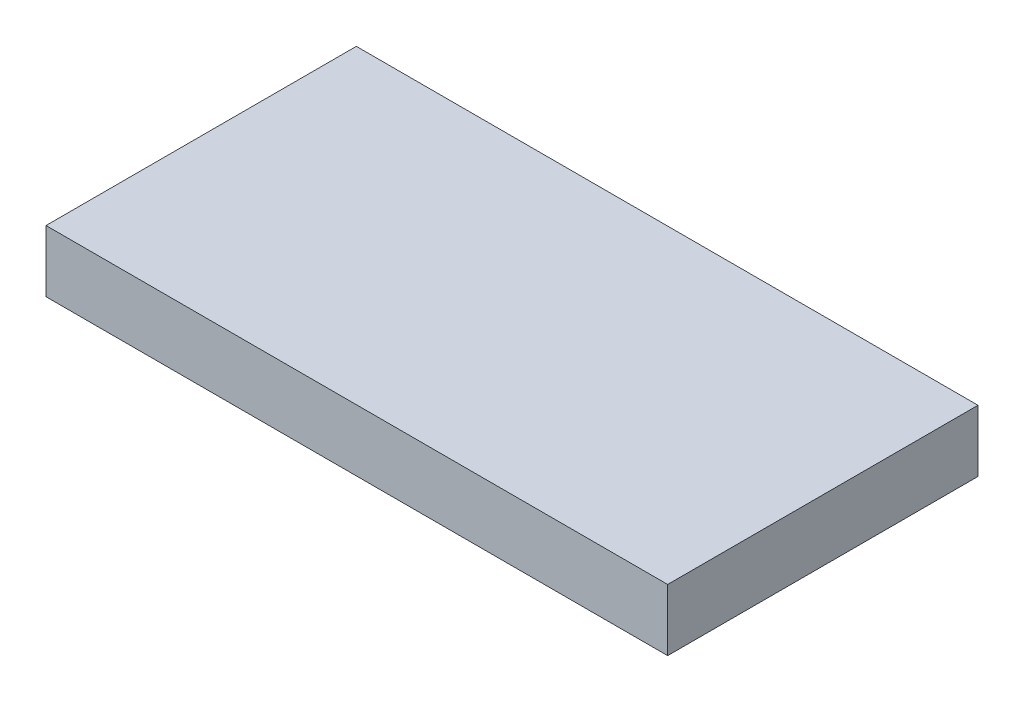
ISO-10303-21;
HEADER;
FILE_DESCRIPTION(('STEP AP214'),'2;1');
FILE_NAME('part.step','',(''),(''),'','','');
FILE_SCHEMA(('AUTOMOTIVE_DESIGN { 1 0 10303 214 1 1 1 1 }'));
ENDSEC;
DATA;
#1=APPLICATION_CONTEXT('core data for automotive mechanical design processes');
#2=APPLICATION_PROTOCOL_DEFINITION('international standard','automotive_design',2000,#1);
#3=PRODUCT_CONTEXT('',#1,'mechanical');
#4=PRODUCT('Part','Part','',(#3));
#5=PRODUCT_RELATED_PRODUCT_CATEGORY('part','',(#4));
#6=PRODUCT_DEFINITION_FORMATION('','',#4);
#7=PRODUCT_DEFINITION_CONTEXT('part definition',#1,'design');
#8=PRODUCT_DEFINITION('design','',#6,#7);
#9=PRODUCT_DEFINITION_SHAPE('','',#8);
#10=(LENGTH_UNIT() NAMED_UNIT(*) SI_UNIT(.MILLI.,.METRE.));
#11=(NAMED_UNIT(*) PLANE_ANGLE_UNIT() SI_UNIT($,.RADIAN.));
#12=(NAMED_UNIT(*) SI_UNIT($,.STERADIAN.) SOLID_ANGLE_UNIT());
#13=UNCERTAINTY_MEASURE_WITH_UNIT(LENGTH_MEASURE(1.E-05),#10,'distance_accuracy_value','');
#14=(GEOMETRIC_REPRESENTATION_CONTEXT(3) GLOBAL_UNCERTAINTY_ASSIGNED_CONTEXT((#13)) GLOBAL_UNIT_ASSIGNED_CONTEXT((#10,
#11,#12)) REPRESENTATION_CONTEXT('',''));
#15=CARTESIAN_POINT('',(0.,0.,0.));
#16=DIRECTION('',(0.,0.,1.));
#17=DIRECTION('',(1.,0.,0.));
#18=AXIS2_PLACEMENT_3D('',#15,#16,#17);
#19=CARTESIAN_POINT('',(15.875,-3.15,-7.925));
#20=DIRECTION('',(1.,0.,0.));
#21=DIRECTION('',(0.,0.,-1.));
#22=AXIS2_PLACEMENT_3D('',#19,#20,#21);
#23=PLANE('',#22);
#24=DIRECTION('',(0.,0.,-1.));
#25=VECTOR('',#24,1.);
#26=CARTESIAN_POINT('',(15.875,0.,-7.925));
#27=LINE('',#26,#25);
#28=CARTESIAN_POINT('',(15.875,0.,7.925));
#29=VERTEX_POINT('',#28);
#30=CARTESIAN_POINT('',(15.875,0.,-7.925));
#31=VERTEX_POINT('',#30);
#32=EDGE_CURVE('E118',#29,#31,#27,.T.);
#33=ORIENTED_EDGE('',*,*,#32,.F.);
#34=DIRECTION('',(0.,1.,0.));
#35=VECTOR('',#34,1.);
#36=CARTESIAN_POINT('',(15.875,-3.15,7.925));
#37=LINE('',#36,#35);
#38=CARTESIAN_POINT('',(15.875,-3.15,7.925));
#39=VERTEX_POINT('',#38);
#40=EDGE_CURVE('E58',#39,#29,#37,.T.);
#41=ORIENTED_EDGE('',*,*,#40,.F.);
#42=DIRECTION('',(0.,0.,-1.));
#43=VECTOR('',#42,1.);
#44=CARTESIAN_POINT('',(15.875,-3.15,-7.925));
#45=LINE('',#44,#43);
#46=CARTESIAN_POINT('',(15.875,-3.15,-7.925));
#47=VERTEX_POINT('',#46);
#48=EDGE_CURVE('E150',#39,#47,#45,.T.);
#49=ORIENTED_EDGE('',*,*,#48,.T.);
#50=DIRECTION('',(0.,1.,0.));
#51=VECTOR('',#50,1.);
#52=CARTESIAN_POINT('',(15.875,-3.15,-7.925));
#53=LINE('',#52,#51);
#54=EDGE_CURVE('E84',#47,#31,#53,.T.);
#55=ORIENTED_EDGE('',*,*,#54,.T.);
#56=EDGE_LOOP('',(#33,#41,#49,#55));
#57=FACE_BOUND('',#56,.T.);
#58=ADVANCED_FACE('F35',(#57),#23,.T.);
#59=CARTESIAN_POINT('',(-15.875,-3.15,7.925));
#60=DIRECTION('',(0.,0.,1.));
#61=DIRECTION('',(1.,0.,0.));
#62=AXIS2_PLACEMENT_3D('',#59,#60,#61);
#63=PLANE('',#62);
#64=DIRECTION('',(1.,0.,0.));
#65=VECTOR('',#64,1.);
#66=CARTESIAN_POINT('',(-15.875,0.,7.925));
#67=LINE('',#66,#65);
#68=CARTESIAN_POINT('',(-15.875,0.,7.925));
#69=VERTEX_POINT('',#68);
#70=EDGE_CURVE('E153',#69,#29,#67,.T.);
#71=ORIENTED_EDGE('',*,*,#70,.F.);
#72=DIRECTION('',(0.,1.,0.));
#73=VECTOR('',#72,1.);
#74=CARTESIAN_POINT('',(-15.875,-3.15,7.925));
#75=LINE('',#74,#73);
#76=CARTESIAN_POINT('',(-15.875,-3.15,7.925));
#77=VERTEX_POINT('',#76);
#78=EDGE_CURVE('E172',#77,#69,#75,.T.);
#79=ORIENTED_EDGE('',*,*,#78,.F.);
#80=DIRECTION('',(1.,0.,0.));
#81=VECTOR('',#80,1.);
#82=CARTESIAN_POINT('',(-15.875,-3.15,7.925));
#83=LINE('',#82,#81);
#84=EDGE_CURVE('E158',#77,#39,#83,.T.);
#85=ORIENTED_EDGE('',*,*,#84,.T.);
#86=ORIENTED_EDGE('',*,*,#40,.T.);
#87=EDGE_LOOP('',(#71,#79,#85,#86));
#88=FACE_BOUND('',#87,.T.);
#89=ADVANCED_FACE('F206',(#88),#63,.T.);
#90=CARTESIAN_POINT('',(-15.875,-3.15,-7.925));
#91=DIRECTION('',(-1.,0.,0.));
#92=DIRECTION('',(0.,0.,1.));
#93=AXIS2_PLACEMENT_3D('',#90,#91,#92);
#94=PLANE('',#93);
#95=DIRECTION('',(0.,0.,1.));
#96=VECTOR('',#95,1.);
#97=CARTESIAN_POINT('',(-15.875,0.,-7.925));
#98=LINE('',#97,#96);
#99=CARTESIAN_POINT('',(-15.875,0.,-7.925));
#100=VERTEX_POINT('',#99);
#101=EDGE_CURVE('E165',#100,#69,#98,.T.);
#102=ORIENTED_EDGE('',*,*,#101,.F.);
#103=DIRECTION('',(0.,1.,0.));
#104=VECTOR('',#103,1.);
#105=CARTESIAN_POINT('',(-15.875,-3.15,-7.925));
#106=LINE('',#105,#104);
#107=CARTESIAN_POINT('',(-15.875,-3.15,-7.925));
#108=VERTEX_POINT('',#107);
#109=EDGE_CURVE('E174',#108,#100,#106,.T.);
#110=ORIENTED_EDGE('',*,*,#109,.F.);
#111=DIRECTION('',(0.,0.,1.));
#112=VECTOR('',#111,1.);
#113=CARTESIAN_POINT('',(-15.875,-3.15,-7.925));
#114=LINE('',#113,#112);
#115=EDGE_CURVE('E155',#108,#77,#114,.T.);
#116=ORIENTED_EDGE('',*,*,#115,.T.);
#117=ORIENTED_EDGE('',*,*,#78,.T.);
#118=EDGE_LOOP('',(#102,#110,#116,#117));
#119=FACE_BOUND('',#118,.T.);
#120=ADVANCED_FACE('F210',(#119),#94,.T.);
#121=CARTESIAN_POINT('',(-15.875,-3.15,-7.925));
#122=DIRECTION('',(0.,0.,-1.));
#123=DIRECTION('',(-1.,0.,0.));
#124=AXIS2_PLACEMENT_3D('',#121,#122,#123);
#125=PLANE('',#124);
#126=DIRECTION('',(-1.,0.,0.));
#127=VECTOR('',#126,1.);
#128=CARTESIAN_POINT('',(-15.875,0.,-7.925));
#129=LINE('',#128,#127);
#130=EDGE_CURVE('E162',#31,#100,#129,.T.);
#131=ORIENTED_EDGE('',*,*,#130,.F.);
#132=ORIENTED_EDGE('',*,*,#54,.F.);
#133=DIRECTION('',(-1.,0.,0.));
#134=VECTOR('',#133,1.);
#135=CARTESIAN_POINT('',(-15.875,-3.15,-7.925));
#136=LINE('',#135,#134);
#137=EDGE_CURVE('E152',#47,#108,#136,.T.);
#138=ORIENTED_EDGE('',*,*,#137,.T.);
#139=ORIENTED_EDGE('',*,*,#109,.T.);
#140=EDGE_LOOP('',(#131,#132,#138,#139));
#141=FACE_BOUND('',#140,.T.);
#142=ADVANCED_FACE('F220',(#141),#125,.T.);
#143=CARTESIAN_POINT('',(0.,-3.15,0.));
#144=DIRECTION('',(0.,1.,0.));
#145=DIRECTION('',(0.,0.,1.));
#146=AXIS2_PLACEMENT_3D('',#143,#144,#145);
#147=PLANE('',#146);
#148=DIRECTION('',(1.,0.,0.));
#149=VECTOR('',#148,1.);
#150=CARTESIAN_POINT('',(0.,-3.15,6.425));
#151=LINE('',#150,#149);
#152=CARTESIAN_POINT('',(-14.375,-3.15,6.425));
#153=VERTEX_POINT('',#152);
#154=CARTESIAN_POINT('',(14.375,-3.15,6.425));
#155=VERTEX_POINT('',#154);
#156=EDGE_CURVE('E145',#153,#155,#151,.T.);
#157=ORIENTED_EDGE('',*,*,#156,.T.);
#158=DIRECTION('',(0.,0.,-1.));
#159=VECTOR('',#158,1.);
#160=CARTESIAN_POINT('',(14.375,-3.15,0.));
#161=LINE('',#160,#159);
#162=CARTESIAN_POINT('',(14.375,-3.15,-6.425));
#163=VERTEX_POINT('',#162);
#164=EDGE_CURVE('E113',#155,#163,#161,.T.);
#165=ORIENTED_EDGE('',*,*,#164,.T.);
#166=DIRECTION('',(-1.,0.,0.));
#167=VECTOR('',#166,1.);
#168=CARTESIAN_POINT('',(0.,-3.15,-6.425));
#169=LINE('',#168,#167);
#170=CARTESIAN_POINT('',(-14.375,-3.15,-6.425));
#171=VERTEX_POINT('',#170);
#172=EDGE_CURVE('E135',#163,#171,#169,.T.);
#173=ORIENTED_EDGE('',*,*,#172,.T.);
#174=DIRECTION('',(0.,0.,1.));
#175=VECTOR('',#174,1.);
#176=CARTESIAN_POINT('',(-14.375,-3.15,0.));
#177=LINE('',#176,#175);
#178=EDGE_CURVE('E49',#171,#153,#177,.T.);
#179=ORIENTED_EDGE('',*,*,#178,.T.);
#180=EDGE_LOOP('',(#157,#165,#173,#179));
#181=FACE_BOUND('',#180,.T.);
#182=ORIENTED_EDGE('',*,*,#48,.F.);
#183=ORIENTED_EDGE('',*,*,#84,.F.);
#184=ORIENTED_EDGE('',*,*,#115,.F.);
#185=ORIENTED_EDGE('',*,*,#137,.F.);
#186=EDGE_LOOP('',(#182,#183,#184,#185));
#187=FACE_BOUND('',#186,.T.);
#188=ADVANCED_FACE('F219',(#181,#187),#147,.F.);
#189=CARTESIAN_POINT('',(0.,0.,0.));
#190=DIRECTION('',(0.,1.,0.));
#191=DIRECTION('',(0.,0.,1.));
#192=AXIS2_PLACEMENT_3D('',#189,#190,#191);
#193=PLANE('',#192);
#194=ORIENTED_EDGE('',*,*,#32,.T.);
#195=ORIENTED_EDGE('',*,*,#130,.T.);
#196=ORIENTED_EDGE('',*,*,#101,.T.);
#197=ORIENTED_EDGE('',*,*,#70,.T.);
#198=EDGE_LOOP('',(#194,#195,#196,#197));
#199=FACE_BOUND('',#198,.T.);
#200=ADVANCED_FACE('F213',(#199),#193,.T.);
#201=CARTESIAN_POINT('',(14.375,-3.15,-7.925));
#202=DIRECTION('',(1.,0.,0.));
#203=DIRECTION('',(0.,0.,-1.));
#204=AXIS2_PLACEMENT_3D('',#201,#202,#203);
#205=PLANE('',#204);
#206=DIRECTION('',(0.,0.,-1.));
#207=VECTOR('',#206,1.);
#208=CARTESIAN_POINT('',(14.375,-1.5,0.));
#209=LINE('',#208,#207);
#210=CARTESIAN_POINT('',(14.375,-1.5,6.425));
#211=VERTEX_POINT('',#210);
#212=CARTESIAN_POINT('',(14.375,-1.5,-6.425));
#213=VERTEX_POINT('',#212);
#214=EDGE_CURVE('E111',#211,#213,#209,.T.);
#215=ORIENTED_EDGE('',*,*,#214,.T.);
#216=DIRECTION('',(0.,1.,0.));
#217=VECTOR('',#216,1.);
#218=CARTESIAN_POINT('',(14.375,-3.15,-6.425));
#219=LINE('',#218,#217);
#220=EDGE_CURVE('E140',#163,#213,#219,.T.);
#221=ORIENTED_EDGE('',*,*,#220,.F.);
#222=ORIENTED_EDGE('',*,*,#164,.F.);
#223=DIRECTION('',(0.,1.,0.));
#224=VECTOR('',#223,1.);
#225=CARTESIAN_POINT('',(14.375,-3.15,6.425));
#226=LINE('',#225,#224);
#227=EDGE_CURVE('E108',#155,#211,#226,.T.);
#228=ORIENTED_EDGE('',*,*,#227,.T.);
#229=EDGE_LOOP('',(#215,#221,#222,#228));
#230=FACE_BOUND('',#229,.T.);
#231=ADVANCED_FACE('F110',(#230),#205,.F.);
#232=CARTESIAN_POINT('',(-15.875,-3.15,6.425));
#233=DIRECTION('',(0.,0.,1.));
#234=DIRECTION('',(1.,0.,0.));
#235=AXIS2_PLACEMENT_3D('',#232,#233,#234);
#236=PLANE('',#235);
#237=DIRECTION('',(1.,0.,0.));
#238=VECTOR('',#237,1.);
#239=CARTESIAN_POINT('',(0.,-1.5,6.425));
#240=LINE('',#239,#238);
#241=CARTESIAN_POINT('',(-14.375,-1.5,6.425));
#242=VERTEX_POINT('',#241);
#243=EDGE_CURVE('E126',#242,#211,#240,.T.);
#244=ORIENTED_EDGE('',*,*,#243,.T.);
#245=ORIENTED_EDGE('',*,*,#227,.F.);
#246=ORIENTED_EDGE('',*,*,#156,.F.);
#247=DIRECTION('',(0.,1.,0.));
#248=VECTOR('',#247,1.);
#249=CARTESIAN_POINT('',(-14.375,-3.15,6.425));
#250=LINE('',#249,#248);
#251=EDGE_CURVE('E119',#153,#242,#250,.T.);
#252=ORIENTED_EDGE('',*,*,#251,.T.);
#253=EDGE_LOOP('',(#244,#245,#246,#252));
#254=FACE_BOUND('',#253,.T.);
#255=ADVANCED_FACE('F131',(#254),#236,.F.);
#256=CARTESIAN_POINT('',(-14.375,-3.15,-7.925));
#257=DIRECTION('',(-1.,0.,0.));
#258=DIRECTION('',(0.,0.,1.));
#259=AXIS2_PLACEMENT_3D('',#256,#257,#258);
#260=PLANE('',#259);
#261=DIRECTION('',(0.,0.,1.));
#262=VECTOR('',#261,1.);
#263=CARTESIAN_POINT('',(-14.375,-1.5,0.));
#264=LINE('',#263,#262);
#265=CARTESIAN_POINT('',(-14.375,-1.5,-6.425));
#266=VERTEX_POINT('',#265);
#267=EDGE_CURVE('E133',#266,#242,#264,.T.);
#268=ORIENTED_EDGE('',*,*,#267,.T.);
#269=ORIENTED_EDGE('',*,*,#251,.F.);
#270=ORIENTED_EDGE('',*,*,#178,.F.);
#271=DIRECTION('',(0.,1.,0.));
#272=VECTOR('',#271,1.);
#273=CARTESIAN_POINT('',(-14.375,-3.15,-6.425));
#274=LINE('',#273,#272);
#275=EDGE_CURVE('E141',#171,#266,#274,.T.);
#276=ORIENTED_EDGE('',*,*,#275,.T.);
#277=EDGE_LOOP('',(#268,#269,#270,#276));
#278=FACE_BOUND('',#277,.T.);
#279=ADVANCED_FACE('F234',(#278),#260,.F.);
#280=CARTESIAN_POINT('',(-15.875,-3.15,-6.425));
#281=DIRECTION('',(0.,0.,-1.));
#282=DIRECTION('',(-1.,0.,0.));
#283=AXIS2_PLACEMENT_3D('',#280,#281,#282);
#284=PLANE('',#283);
#285=DIRECTION('',(-1.,0.,0.));
#286=VECTOR('',#285,1.);
#287=CARTESIAN_POINT('',(0.,-1.5,-6.425));
#288=LINE('',#287,#286);
#289=EDGE_CURVE('E128',#213,#266,#288,.T.);
#290=ORIENTED_EDGE('',*,*,#289,.T.);
#291=ORIENTED_EDGE('',*,*,#275,.F.);
#292=ORIENTED_EDGE('',*,*,#172,.F.);
#293=ORIENTED_EDGE('',*,*,#220,.T.);
#294=EDGE_LOOP('',(#290,#291,#292,#293));
#295=FACE_BOUND('',#294,.T.);
#296=ADVANCED_FACE('F186',(#295),#284,.F.);
#297=CARTESIAN_POINT('',(0.,-1.5,0.));
#298=DIRECTION('',(0.,1.,0.));
#299=DIRECTION('',(0.,0.,1.));
#300=AXIS2_PLACEMENT_3D('',#297,#298,#299);
#301=PLANE('',#300);
#302=CARTESIAN_POINT('',(0.,-1.5,0.));
#303=DIRECTION('',(0.,1.,0.));
#304=DIRECTION('',(0.,0.,1.));
#305=AXIS2_PLACEMENT_3D('',#302,#303,#304);
#306=CIRCLE('',#305,3.225);
#307=CARTESIAN_POINT('',(0.,-1.5,3.225));
#308=VERTEX_POINT('',#307);
#309=EDGE_CURVE('E12',#308,#308,#306,.F.);
#310=ORIENTED_EDGE('',*,*,#309,.F.);
#311=EDGE_LOOP('',(#310));
#312=FACE_BOUND('',#311,.T.);
#313=CARTESIAN_POINT('',(-7.9375,-1.5,0.));
#314=DIRECTION('',(0.,1.,0.));
#315=DIRECTION('',(0.,0.,1.));
#316=AXIS2_PLACEMENT_3D('',#313,#314,#315);
#317=CIRCLE('',#316,3.225);
#318=CARTESIAN_POINT('',(-7.9375,-1.5,3.225));
#319=VERTEX_POINT('',#318);
#320=EDGE_CURVE('E42',#319,#319,#317,.F.);
#321=ORIENTED_EDGE('',*,*,#320,.F.);
#322=EDGE_LOOP('',(#321));
#323=FACE_BOUND('',#322,.T.);
#324=CARTESIAN_POINT('',(7.9375,-1.5,0.));
#325=DIRECTION('',(0.,1.,0.));
#326=DIRECTION('',(0.,0.,1.));
#327=AXIS2_PLACEMENT_3D('',#324,#325,#326);
#328=CIRCLE('',#327,3.225);
#329=CARTESIAN_POINT('',(7.9375,-1.5,3.22500000000001));
#330=VERTEX_POINT('',#329);
#331=EDGE_CURVE('E171',#330,#330,#328,.F.);
#332=ORIENTED_EDGE('',*,*,#331,.F.);
#333=EDGE_LOOP('',(#332));
#334=FACE_BOUND('',#333,.T.);
#335=ORIENTED_EDGE('',*,*,#214,.F.);
#336=ORIENTED_EDGE('',*,*,#243,.F.);
#337=ORIENTED_EDGE('',*,*,#267,.F.);
#338=ORIENTED_EDGE('',*,*,#289,.F.);
#339=EDGE_LOOP('',(#335,#336,#337,#338));
#340=FACE_BOUND('',#339,.T.);
#341=ADVANCED_FACE('F124',(#312,#323,#334,#340),#301,.F.);
#342=CARTESIAN_POINT('',(7.9375,-12.2716774773065,0.));
#343=DIRECTION('',(0.,1.,0.));
#344=DIRECTION('',(0.,0.,1.));
#345=AXIS2_PLACEMENT_3D('',#342,#343,#344);
#346=CYLINDRICAL_SURFACE('',#345,3.225);
#347=CARTESIAN_POINT('',(7.9375,-2.95,0.));
#348=DIRECTION('',(0.,1.,0.));
#349=DIRECTION('',(0.,0.,1.));
#350=AXIS2_PLACEMENT_3D('',#347,#348,#349);
#351=CIRCLE('',#350,3.225);
#352=CARTESIAN_POINT('',(7.9375,-2.95,3.22500000000001));
#353=VERTEX_POINT('',#352);
#354=EDGE_CURVE('E253',#353,#353,#351,.T.);
#355=ORIENTED_EDGE('',*,*,#354,.T.);
#356=EDGE_LOOP('',(#355));
#357=FACE_BOUND('',#356,.T.);
#358=ORIENTED_EDGE('',*,*,#331,.T.);
#359=EDGE_LOOP('',(#358));
#360=FACE_BOUND('',#359,.T.);
#361=ADVANCED_FACE('F185',(#357,#360),#346,.T.);
#362=CARTESIAN_POINT('',(7.9375,-12.2716774773065,0.));
#363=DIRECTION('',(0.,1.,0.));
#364=DIRECTION('',(0.,0.,1.));
#365=AXIS2_PLACEMENT_3D('',#362,#363,#364);
#366=CYLINDRICAL_SURFACE('',#365,2.475);
#367=CARTESIAN_POINT('',(7.9375,-2.95,0.));
#368=DIRECTION('',(0.,1.,0.));
#369=DIRECTION('',(0.,0.,1.));
#370=AXIS2_PLACEMENT_3D('',#367,#368,#369);
#371=CIRCLE('',#370,2.475);
#372=CARTESIAN_POINT('',(7.9375,-2.95,2.47500000000001));
#373=VERTEX_POINT('',#372);
#374=EDGE_CURVE('E129',#373,#373,#371,.T.);
#375=ORIENTED_EDGE('',*,*,#374,.F.);
#376=EDGE_LOOP('',(#375));
#377=FACE_BOUND('',#376,.T.);
#378=CARTESIAN_POINT('',(7.9375,-1.5,0.));
#379=DIRECTION('',(0.,-1.,0.));
#380=DIRECTION('',(0.,0.,1.));
#381=AXIS2_PLACEMENT_3D('',#378,#379,#380);
#382=CIRCLE('',#381,2.475);
#383=CARTESIAN_POINT('',(7.9375,-1.5,2.47500000000001));
#384=VERTEX_POINT('',#383);
#385=EDGE_CURVE('E254',#384,#384,#382,.T.);
#386=ORIENTED_EDGE('',*,*,#385,.F.);
#387=EDGE_LOOP('',(#386));
#388=FACE_BOUND('',#387,.T.);
#389=ADVANCED_FACE('F194',(#377,#388),#366,.F.);
#390=CARTESIAN_POINT('',(0.,-2.95,0.));
#391=DIRECTION('',(0.,1.,0.));
#392=DIRECTION('',(0.,0.,1.));
#393=AXIS2_PLACEMENT_3D('',#390,#391,#392);
#394=PLANE('',#393);
#395=ORIENTED_EDGE('',*,*,#374,.T.);
#396=EDGE_LOOP('',(#395));
#397=FACE_BOUND('',#396,.T.);
#398=ORIENTED_EDGE('',*,*,#354,.F.);
#399=EDGE_LOOP('',(#398));
#400=FACE_BOUND('',#399,.T.);
#401=ADVANCED_FACE('F200',(#397,#400),#394,.F.);
#402=ORIENTED_EDGE('',*,*,#385,.T.);
#403=EDGE_LOOP('',(#402));
#404=FACE_BOUND('',#403,.T.);
#405=ADVANCED_FACE('F190',(#404),#301,.F.);
#406=CARTESIAN_POINT('',(-7.9375,-12.2716774773065,0.));
#407=DIRECTION('',(0.,1.,0.));
#408=DIRECTION('',(0.,0.,1.));
#409=AXIS2_PLACEMENT_3D('',#406,#407,#408);
#410=CYLINDRICAL_SURFACE('',#409,3.225);
#411=CARTESIAN_POINT('',(-7.9375,-2.95,0.));
#412=DIRECTION('',(0.,1.,0.));
#413=DIRECTION('',(0.,0.,1.));
#414=AXIS2_PLACEMENT_3D('',#411,#412,#413);
#415=CIRCLE('',#414,3.225);
#416=CARTESIAN_POINT('',(-7.9375,-2.95,3.225));
#417=VERTEX_POINT('',#416);
#418=EDGE_CURVE('E263',#417,#417,#415,.T.);
#419=ORIENTED_EDGE('',*,*,#418,.T.);
#420=EDGE_LOOP('',(#419));
#421=FACE_BOUND('',#420,.T.);
#422=ORIENTED_EDGE('',*,*,#320,.T.);
#423=EDGE_LOOP('',(#422));
#424=FACE_BOUND('',#423,.T.);
#425=ADVANCED_FACE('F181',(#421,#424),#410,.T.);
#426=CARTESIAN_POINT('',(-7.9375,-12.2716774773065,0.));
#427=DIRECTION('',(0.,1.,0.));
#428=DIRECTION('',(0.,0.,1.));
#429=AXIS2_PLACEMENT_3D('',#426,#427,#428);
#430=CYLINDRICAL_SURFACE('',#429,2.475);
#431=CARTESIAN_POINT('',(-7.9375,-2.95,0.));
#432=DIRECTION('',(0.,1.,0.));
#433=DIRECTION('',(0.,0.,1.));
#434=AXIS2_PLACEMENT_3D('',#431,#432,#433);
#435=CIRCLE('',#434,2.475);
#436=CARTESIAN_POINT('',(-7.9375,-2.95,2.475));
#437=VERTEX_POINT('',#436);
#438=EDGE_CURVE('E258',#437,#437,#435,.T.);
#439=ORIENTED_EDGE('',*,*,#438,.F.);
#440=EDGE_LOOP('',(#439));
#441=FACE_BOUND('',#440,.T.);
#442=CARTESIAN_POINT('',(-7.9375,-1.5,0.));
#443=DIRECTION('',(0.,-1.,0.));
#444=DIRECTION('',(0.,0.,-1.));
#445=AXIS2_PLACEMENT_3D('',#442,#443,#444);
#446=CIRCLE('',#445,2.475);
#447=CARTESIAN_POINT('',(-7.9375,-1.5,-2.475));
#448=VERTEX_POINT('',#447);
#449=EDGE_CURVE('E266',#448,#448,#446,.T.);
#450=ORIENTED_EDGE('',*,*,#449,.F.);
#451=EDGE_LOOP('',(#450));
#452=FACE_BOUND('',#451,.T.);
#453=ADVANCED_FACE('F298',(#441,#452),#430,.F.);
#454=CARTESIAN_POINT('',(0.,-2.95,0.));
#455=DIRECTION('',(0.,1.,0.));
#456=DIRECTION('',(0.,0.,1.));
#457=AXIS2_PLACEMENT_3D('',#454,#455,#456);
#458=PLANE('',#457);
#459=ORIENTED_EDGE('',*,*,#438,.T.);
#460=EDGE_LOOP('',(#459));
#461=FACE_BOUND('',#460,.T.);
#462=ORIENTED_EDGE('',*,*,#418,.F.);
#463=EDGE_LOOP('',(#462));
#464=FACE_BOUND('',#463,.T.);
#465=ADVANCED_FACE('F301',(#461,#464),#458,.F.);
#466=ORIENTED_EDGE('',*,*,#449,.T.);
#467=EDGE_LOOP('',(#466));
#468=FACE_BOUND('',#467,.T.);
#469=ADVANCED_FACE('F248',(#468),#301,.F.);
#470=CARTESIAN_POINT('',(0.,-12.2716774773065,0.));
#471=DIRECTION('',(0.,1.,0.));
#472=DIRECTION('',(0.,0.,1.));
#473=AXIS2_PLACEMENT_3D('',#470,#471,#472);
#474=CYLINDRICAL_SURFACE('',#473,3.225);
#475=CARTESIAN_POINT('',(0.,-2.95,0.));
#476=DIRECTION('',(0.,1.,0.));
#477=DIRECTION('',(0.,0.,1.));
#478=AXIS2_PLACEMENT_3D('',#475,#476,#477);
#479=CIRCLE('',#478,3.225);
#480=CARTESIAN_POINT('',(0.,-2.95,3.225));
#481=VERTEX_POINT('',#480);
#482=EDGE_CURVE('E272',#481,#481,#479,.T.);
#483=ORIENTED_EDGE('',*,*,#482,.T.);
#484=EDGE_LOOP('',(#483));
#485=FACE_BOUND('',#484,.T.);
#486=ORIENTED_EDGE('',*,*,#309,.T.);
#487=EDGE_LOOP('',(#486));
#488=FACE_BOUND('',#487,.T.);
#489=ADVANCED_FACE('F283',(#485,#488),#474,.T.);
#490=CARTESIAN_POINT('',(0.,-12.2716774773065,0.));
#491=DIRECTION('',(0.,1.,0.));
#492=DIRECTION('',(0.,0.,1.));
#493=AXIS2_PLACEMENT_3D('',#490,#491,#492);
#494=CYLINDRICAL_SURFACE('',#493,2.475);
#495=CARTESIAN_POINT('',(0.,-2.95,0.));
#496=DIRECTION('',(0.,1.,0.));
#497=DIRECTION('',(0.,0.,1.));
#498=AXIS2_PLACEMENT_3D('',#495,#496,#497);
#499=CIRCLE('',#498,2.475);
#500=CARTESIAN_POINT('',(0.,-2.95,2.475));
#501=VERTEX_POINT('',#500);
#502=EDGE_CURVE('E269',#501,#501,#499,.T.);
#503=ORIENTED_EDGE('',*,*,#502,.F.);
#504=EDGE_LOOP('',(#503));
#505=FACE_BOUND('',#504,.T.);
#506=CARTESIAN_POINT('',(0.,-1.5,0.));
#507=DIRECTION('',(0.,-1.,0.));
#508=DIRECTION('',(0.,0.,-1.));
#509=AXIS2_PLACEMENT_3D('',#506,#507,#508);
#510=CIRCLE('',#509,2.475);
#511=CARTESIAN_POINT('',(0.,-1.5,-2.475));
#512=VERTEX_POINT('',#511);
#513=EDGE_CURVE('E275',#512,#512,#510,.T.);
#514=ORIENTED_EDGE('',*,*,#513,.F.);
#515=EDGE_LOOP('',(#514));
#516=FACE_BOUND('',#515,.T.);
#517=ADVANCED_FACE('F280',(#505,#516),#494,.F.);
#518=CARTESIAN_POINT('',(0.,-2.95,0.));
#519=DIRECTION('',(0.,1.,0.));
#520=DIRECTION('',(0.,0.,1.));
#521=AXIS2_PLACEMENT_3D('',#518,#519,#520);
#522=PLANE('',#521);
#523=ORIENTED_EDGE('',*,*,#502,.T.);
#524=EDGE_LOOP('',(#523));
#525=FACE_BOUND('',#524,.T.);
#526=ORIENTED_EDGE('',*,*,#482,.F.);
#527=EDGE_LOOP('',(#526));
#528=FACE_BOUND('',#527,.T.);
#529=ADVANCED_FACE('F282',(#525,#528),#522,.F.);
#530=ORIENTED_EDGE('',*,*,#513,.T.);
#531=EDGE_LOOP('',(#530));
#532=FACE_BOUND('',#531,.T.);
#533=ADVANCED_FACE('F189',(#532),#301,.F.);
#534=CLOSED_SHELL('',(#58,#89,#120,#142,#188,#200,#231,#255,#279,#296,#341,#361,#389,#401,#405,
#425,#453,#465,#469,#489,#517,#529,#533));
#535=MANIFOLD_SOLID_BREP('B2',#534);
#536=ADVANCED_BREP_SHAPE_REPRESENTATION('',(#18,#535),#14);
#537=SHAPE_DEFINITION_REPRESENTATION(#9,#536);
ENDSEC;
END-ISO-10303-21;
